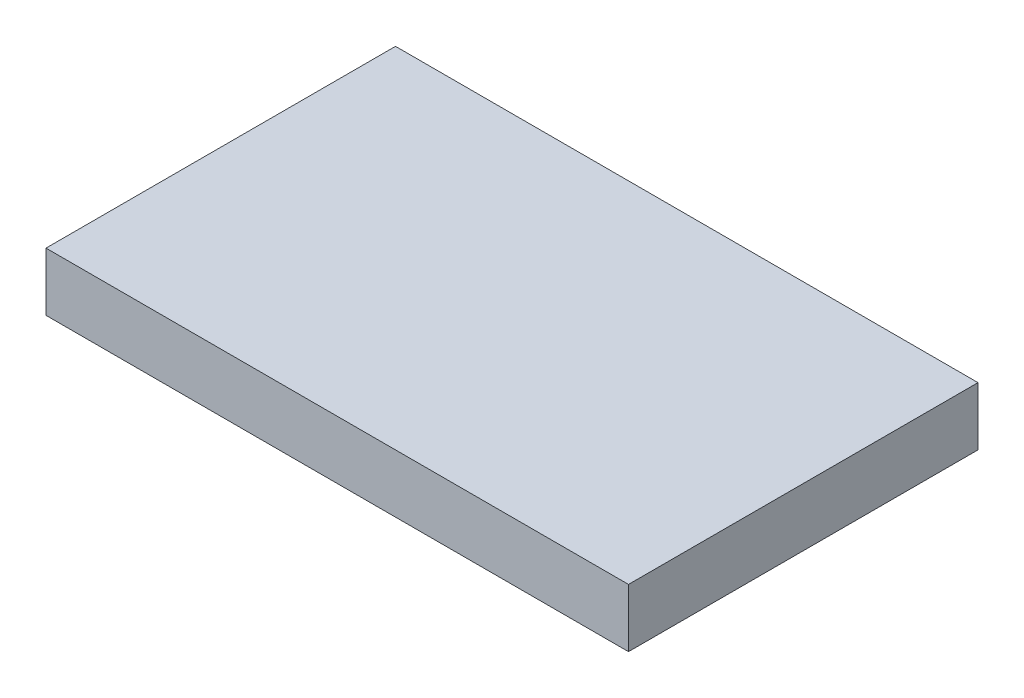
ISO-10303-21;
HEADER;
FILE_DESCRIPTION(('STEP AP214'),'2;1');
FILE_NAME('part.step','',(''),(''),'','','');
FILE_SCHEMA(('AUTOMOTIVE_DESIGN { 1 0 10303 214 1 1 1 1 }'));
ENDSEC;
DATA;
#1=APPLICATION_CONTEXT('core data for automotive mechanical design processes');
#2=APPLICATION_PROTOCOL_DEFINITION('international standard','automotive_design',2000,#1);
#3=PRODUCT_CONTEXT('',#1,'mechanical');
#4=PRODUCT('Part','Part','',(#3));
#5=PRODUCT_RELATED_PRODUCT_CATEGORY('part','',(#4));
#6=PRODUCT_DEFINITION_FORMATION('','',#4);
#7=PRODUCT_DEFINITION_CONTEXT('part definition',#1,'design');
#8=PRODUCT_DEFINITION('design','',#6,#7);
#9=PRODUCT_DEFINITION_SHAPE('','',#8);
#10=(LENGTH_UNIT() NAMED_UNIT(*) SI_UNIT(.MILLI.,.METRE.));
#11=(NAMED_UNIT(*) PLANE_ANGLE_UNIT() SI_UNIT($,.RADIAN.));
#12=(NAMED_UNIT(*) SI_UNIT($,.STERADIAN.) SOLID_ANGLE_UNIT());
#13=UNCERTAINTY_MEASURE_WITH_UNIT(LENGTH_MEASURE(1.E-05),#10,'distance_accuracy_value','');
#14=(GEOMETRIC_REPRESENTATION_CONTEXT(3) GLOBAL_UNCERTAINTY_ASSIGNED_CONTEXT((#13)) GLOBAL_UNIT_ASSIGNED_CONTEXT((#10,
#11,#12)) REPRESENTATION_CONTEXT('',''));
#15=CARTESIAN_POINT('',(0.,0.,0.));
#16=DIRECTION('',(0.,0.,1.));
#17=DIRECTION('',(1.,0.,0.));
#18=AXIS2_PLACEMENT_3D('',#15,#16,#17);
#19=CARTESIAN_POINT('',(-34.1923076923077,6.35,-24.2174089068826));
#20=DIRECTION('',(1.,0.,0.));
#21=DIRECTION('',(0.,0.,-1.));
#22=AXIS2_PLACEMENT_3D('',#19,#20,#21);
#23=PLANE('',#22);
#24=DIRECTION('',(0.,0.,1.));
#25=VECTOR('',#24,1.);
#26=CARTESIAN_POINT('',(-34.1923076923077,0.,-24.2174089068826));
#27=LINE('',#26,#25);
#28=CARTESIAN_POINT('',(-34.1923076923077,0.,-24.2174089068826));
#29=VERTEX_POINT('',#28);
#30=CARTESIAN_POINT('',(-34.1923076923077,0.,13.8825910931174));
#31=VERTEX_POINT('',#30);
#32=EDGE_CURVE('E113',#29,#31,#27,.T.);
#33=ORIENTED_EDGE('',*,*,#32,.T.);
#34=DIRECTION('',(0.,-1.,0.));
#35=VECTOR('',#34,1.);
#36=CARTESIAN_POINT('',(-34.1923076923077,6.35,13.8825910931174));
#37=LINE('',#36,#35);
#38=CARTESIAN_POINT('',(-34.1923076923077,6.35,13.8825910931174));
#39=VERTEX_POINT('',#38);
#40=EDGE_CURVE('E11',#39,#31,#37,.T.);
#41=ORIENTED_EDGE('',*,*,#40,.F.);
#42=DIRECTION('',(0.,0.,1.));
#43=VECTOR('',#42,1.);
#44=CARTESIAN_POINT('',(-34.1923076923077,6.35,-24.2174089068826));
#45=LINE('',#44,#43);
#46=CARTESIAN_POINT('',(-34.1923076923077,6.35,-24.2174089068826));
#47=VERTEX_POINT('',#46);
#48=EDGE_CURVE('E97',#47,#39,#45,.T.);
#49=ORIENTED_EDGE('',*,*,#48,.F.);
#50=DIRECTION('',(0.,-1.,0.));
#51=VECTOR('',#50,1.);
#52=CARTESIAN_POINT('',(-34.1923076923077,6.35,-24.2174089068826));
#53=LINE('',#52,#51);
#54=EDGE_CURVE('E109',#47,#29,#53,.T.);
#55=ORIENTED_EDGE('',*,*,#54,.T.);
#56=EDGE_LOOP('',(#33,#41,#49,#55));
#57=FACE_BOUND('',#56,.T.);
#58=ADVANCED_FACE('F45',(#57),#23,.F.);
#59=CARTESIAN_POINT('',(-34.1923076923077,6.35,13.8825910931174));
#60=DIRECTION('',(0.,0.,-1.));
#61=DIRECTION('',(-1.,0.,0.));
#62=AXIS2_PLACEMENT_3D('',#59,#60,#61);
#63=PLANE('',#62);
#64=DIRECTION('',(1.,0.,0.));
#65=VECTOR('',#64,1.);
#66=CARTESIAN_POINT('',(-34.1923076923077,0.,13.8825910931174));
#67=LINE('',#66,#65);
#68=CARTESIAN_POINT('',(29.3076923076923,0.,13.8825910931174));
#69=VERTEX_POINT('',#68);
#70=EDGE_CURVE('E102',#31,#69,#67,.T.);
#71=ORIENTED_EDGE('',*,*,#70,.T.);
#72=DIRECTION('',(0.,-1.,0.));
#73=VECTOR('',#72,1.);
#74=CARTESIAN_POINT('',(29.3076923076923,6.35,13.8825910931174));
#75=LINE('',#74,#73);
#76=CARTESIAN_POINT('',(29.3076923076923,6.35,13.8825910931174));
#77=VERTEX_POINT('',#76);
#78=EDGE_CURVE('E54',#77,#69,#75,.T.);
#79=ORIENTED_EDGE('',*,*,#78,.F.);
#80=DIRECTION('',(1.,0.,0.));
#81=VECTOR('',#80,1.);
#82=CARTESIAN_POINT('',(-34.1923076923077,6.35,13.8825910931174));
#83=LINE('',#82,#81);
#84=EDGE_CURVE('E92',#39,#77,#83,.T.);
#85=ORIENTED_EDGE('',*,*,#84,.F.);
#86=ORIENTED_EDGE('',*,*,#40,.T.);
#87=EDGE_LOOP('',(#71,#79,#85,#86));
#88=FACE_BOUND('',#87,.T.);
#89=ADVANCED_FACE('F101',(#88),#63,.F.);
#90=CARTESIAN_POINT('',(29.3076923076923,6.35,-24.2174089068826));
#91=DIRECTION('',(-1.,0.,0.));
#92=DIRECTION('',(0.,0.,1.));
#93=AXIS2_PLACEMENT_3D('',#90,#91,#92);
#94=PLANE('',#93);
#95=DIRECTION('',(0.,0.,-1.));
#96=VECTOR('',#95,1.);
#97=CARTESIAN_POINT('',(29.3076923076923,0.,-24.2174089068826));
#98=LINE('',#97,#96);
#99=CARTESIAN_POINT('',(29.3076923076923,0.,-24.2174089068826));
#100=VERTEX_POINT('',#99);
#101=EDGE_CURVE('E79',#69,#100,#98,.T.);
#102=ORIENTED_EDGE('',*,*,#101,.T.);
#103=DIRECTION('',(0.,-1.,0.));
#104=VECTOR('',#103,1.);
#105=CARTESIAN_POINT('',(29.3076923076923,6.35,-24.2174089068826));
#106=LINE('',#105,#104);
#107=CARTESIAN_POINT('',(29.3076923076923,6.35,-24.2174089068826));
#108=VERTEX_POINT('',#107);
#109=EDGE_CURVE('E104',#108,#100,#106,.T.);
#110=ORIENTED_EDGE('',*,*,#109,.F.);
#111=DIRECTION('',(0.,0.,-1.));
#112=VECTOR('',#111,1.);
#113=CARTESIAN_POINT('',(29.3076923076923,6.35,-24.2174089068826));
#114=LINE('',#113,#112);
#115=EDGE_CURVE('E95',#77,#108,#114,.T.);
#116=ORIENTED_EDGE('',*,*,#115,.F.);
#117=ORIENTED_EDGE('',*,*,#78,.T.);
#118=EDGE_LOOP('',(#102,#110,#116,#117));
#119=FACE_BOUND('',#118,.T.);
#120=ADVANCED_FACE('F105',(#119),#94,.F.);
#121=CARTESIAN_POINT('',(-34.1923076923077,6.35,-24.2174089068826));
#122=DIRECTION('',(0.,0.,1.));
#123=DIRECTION('',(1.,0.,0.));
#124=AXIS2_PLACEMENT_3D('',#121,#122,#123);
#125=PLANE('',#124);
#126=DIRECTION('',(-1.,0.,0.));
#127=VECTOR('',#126,1.);
#128=CARTESIAN_POINT('',(-34.1923076923077,0.,-24.2174089068826));
#129=LINE('',#128,#127);
#130=EDGE_CURVE('E85',#100,#29,#129,.T.);
#131=ORIENTED_EDGE('',*,*,#130,.T.);
#132=ORIENTED_EDGE('',*,*,#54,.F.);
#133=DIRECTION('',(-1.,0.,0.));
#134=VECTOR('',#133,1.);
#135=CARTESIAN_POINT('',(-34.1923076923077,6.35,-24.2174089068826));
#136=LINE('',#135,#134);
#137=EDGE_CURVE('E62',#108,#47,#136,.T.);
#138=ORIENTED_EDGE('',*,*,#137,.F.);
#139=ORIENTED_EDGE('',*,*,#109,.T.);
#140=EDGE_LOOP('',(#131,#132,#138,#139));
#141=FACE_BOUND('',#140,.T.);
#142=ADVANCED_FACE('F126',(#141),#125,.F.);
#143=CARTESIAN_POINT('',(0.,6.35,0.));
#144=DIRECTION('',(0.,1.,0.));
#145=DIRECTION('',(0.,0.,1.));
#146=AXIS2_PLACEMENT_3D('',#143,#144,#145);
#147=PLANE('',#146);
#148=ORIENTED_EDGE('',*,*,#48,.T.);
#149=ORIENTED_EDGE('',*,*,#84,.T.);
#150=ORIENTED_EDGE('',*,*,#115,.T.);
#151=ORIENTED_EDGE('',*,*,#137,.T.);
#152=EDGE_LOOP('',(#148,#149,#150,#151));
#153=FACE_BOUND('',#152,.T.);
#154=ADVANCED_FACE('F93',(#153),#147,.T.);
#155=CARTESIAN_POINT('',(0.,0.,0.));
#156=DIRECTION('',(0.,1.,0.));
#157=DIRECTION('',(0.,0.,1.));
#158=AXIS2_PLACEMENT_3D('',#155,#156,#157);
#159=PLANE('',#158);
#160=ORIENTED_EDGE('',*,*,#32,.F.);
#161=ORIENTED_EDGE('',*,*,#130,.F.);
#162=ORIENTED_EDGE('',*,*,#101,.F.);
#163=ORIENTED_EDGE('',*,*,#70,.F.);
#164=EDGE_LOOP('',(#160,#161,#162,#163));
#165=FACE_BOUND('',#164,.T.);
#166=ADVANCED_FACE('F129',(#165),#159,.F.);
#167=CLOSED_SHELL('',(#58,#89,#120,#142,#154,#166));
#168=MANIFOLD_SOLID_BREP('B2',#167);
#169=ADVANCED_BREP_SHAPE_REPRESENTATION('',(#18,#168),#14);
#170=SHAPE_DEFINITION_REPRESENTATION(#9,#169);
ENDSEC;
END-ISO-10303-21;
